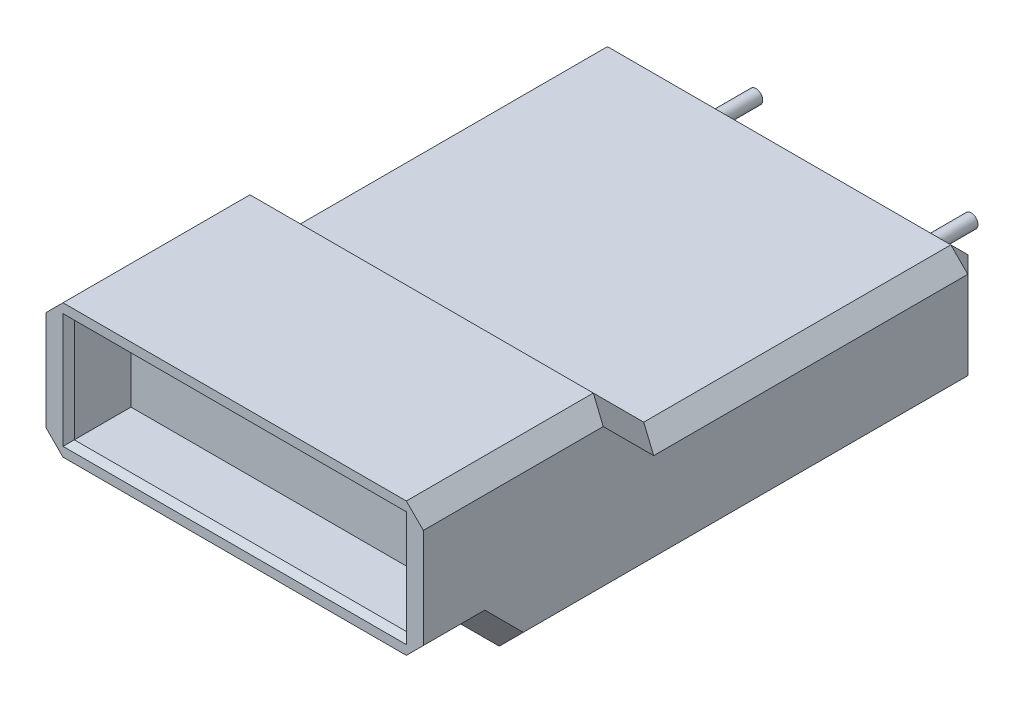
ISO-10303-21;
HEADER;
FILE_DESCRIPTION(('STEP AP214'),'2;1');
FILE_NAME('part.step','',(''),(''),'','','');
FILE_SCHEMA(('AUTOMOTIVE_DESIGN { 1 0 10303 214 1 1 1 1 }'));
ENDSEC;
DATA;
#1=APPLICATION_CONTEXT('core data for automotive mechanical design processes');
#2=APPLICATION_PROTOCOL_DEFINITION('international standard','automotive_design',2000,#1);
#3=PRODUCT_CONTEXT('',#1,'mechanical');
#4=PRODUCT('Part','Part','',(#3));
#5=PRODUCT_RELATED_PRODUCT_CATEGORY('part','',(#4));
#6=PRODUCT_DEFINITION_FORMATION('','',#4);
#7=PRODUCT_DEFINITION_CONTEXT('part definition',#1,'design');
#8=PRODUCT_DEFINITION('design','',#6,#7);
#9=PRODUCT_DEFINITION_SHAPE('','',#8);
#10=(LENGTH_UNIT() NAMED_UNIT(*) SI_UNIT(.MILLI.,.METRE.));
#11=(NAMED_UNIT(*) PLANE_ANGLE_UNIT() SI_UNIT($,.RADIAN.));
#12=(NAMED_UNIT(*) SI_UNIT($,.STERADIAN.) SOLID_ANGLE_UNIT());
#13=UNCERTAINTY_MEASURE_WITH_UNIT(LENGTH_MEASURE(1.E-05),#10,'distance_accuracy_value','');
#14=(GEOMETRIC_REPRESENTATION_CONTEXT(3) GLOBAL_UNCERTAINTY_ASSIGNED_CONTEXT((#13)) GLOBAL_UNIT_ASSIGNED_CONTEXT((#10,
#11,#12)) REPRESENTATION_CONTEXT('',''));
#15=CARTESIAN_POINT('',(0.,0.,0.));
#16=DIRECTION('',(0.,0.,1.));
#17=DIRECTION('',(1.,0.,0.));
#18=AXIS2_PLACEMENT_3D('',#15,#16,#17);
#19=CARTESIAN_POINT('',(-16.65,3.4,24.775));
#20=DIRECTION('',(0.,0.,1.));
#21=DIRECTION('',(1.,0.,0.));
#22=AXIS2_PLACEMENT_3D('',#19,#20,#21);
#23=PLANE('',#22);
#24=DIRECTION('',(1.,0.,0.));
#25=VECTOR('',#24,1.);
#26=CARTESIAN_POINT('',(14.65,14.375,24.775));
#27=LINE('',#26,#25);
#28=CARTESIAN_POINT('',(-15.15,14.375,24.775));
#29=VERTEX_POINT('',#28);
#30=CARTESIAN_POINT('',(15.15,14.375,24.775));
#31=VERTEX_POINT('',#30);
#32=EDGE_CURVE('E410',#29,#31,#27,.T.);
#33=ORIENTED_EDGE('',*,*,#32,.T.);
#34=DIRECTION('',(0.,-1.,0.));
#35=VECTOR('',#34,1.);
#36=CARTESIAN_POINT('',(15.15,4.725,24.775));
#37=LINE('',#36,#35);
#38=CARTESIAN_POINT('',(15.15,4.22499999999999,24.775));
#39=VERTEX_POINT('',#38);
#40=EDGE_CURVE('E414',#31,#39,#37,.T.);
#41=ORIENTED_EDGE('',*,*,#40,.T.);
#42=DIRECTION('',(-1.,0.,0.));
#43=VECTOR('',#42,1.);
#44=CARTESIAN_POINT('',(-14.65,4.22499999999999,24.775));
#45=LINE('',#44,#43);
#46=CARTESIAN_POINT('',(-15.15,4.22499999999999,24.775));
#47=VERTEX_POINT('',#46);
#48=EDGE_CURVE('E412',#39,#47,#45,.T.);
#49=ORIENTED_EDGE('',*,*,#48,.T.);
#50=DIRECTION('',(0.,1.,0.));
#51=VECTOR('',#50,1.);
#52=CARTESIAN_POINT('',(-15.15,13.875,24.775));
#53=LINE('',#52,#51);
#54=EDGE_CURVE('E408',#47,#29,#53,.T.);
#55=ORIENTED_EDGE('',*,*,#54,.T.);
#56=EDGE_LOOP('',(#33,#41,#49,#55));
#57=FACE_BOUND('',#56,.T.);
#58=DIRECTION('',(0.,-1.,0.));
#59=VECTOR('',#58,1.);
#60=CARTESIAN_POINT('',(-16.65,3.4,24.775));
#61=LINE('',#60,#59);
#62=CARTESIAN_POINT('',(-16.65,13.7,24.775));
#63=VERTEX_POINT('',#62);
#64=CARTESIAN_POINT('',(-16.65,4.90000000000001,24.775));
#65=VERTEX_POINT('',#64);
#66=EDGE_CURVE('E253',#63,#65,#61,.T.);
#67=ORIENTED_EDGE('',*,*,#66,.T.);
#68=DIRECTION('',(-0.707106781186546,0.707106781186549,0.));
#69=VECTOR('',#68,1.);
#70=CARTESIAN_POINT('',(-15.9,4.15,24.775));
#71=LINE('',#70,#69);
#72=CARTESIAN_POINT('',(-15.15,3.4,24.775));
#73=VERTEX_POINT('',#72);
#74=EDGE_CURVE('E309',#65,#73,#71,.F.);
#75=ORIENTED_EDGE('',*,*,#74,.T.);
#76=DIRECTION('',(1.,0.,0.));
#77=VECTOR('',#76,1.);
#78=CARTESIAN_POINT('',(-16.65,3.4,24.775));
#79=LINE('',#78,#77);
#80=CARTESIAN_POINT('',(15.15,3.4,24.775));
#81=VERTEX_POINT('',#80);
#82=EDGE_CURVE('E257',#73,#81,#79,.T.);
#83=ORIENTED_EDGE('',*,*,#82,.T.);
#84=DIRECTION('',(0.707106781186549,0.707106781186546,0.));
#85=VECTOR('',#84,1.);
#86=CARTESIAN_POINT('',(-0.750000000000077,-12.5,24.775));
#87=LINE('',#86,#85);
#88=CARTESIAN_POINT('',(16.65,4.9,24.775));
#89=VERTEX_POINT('',#88);
#90=EDGE_CURVE('E307',#81,#89,#87,.T.);
#91=ORIENTED_EDGE('',*,*,#90,.T.);
#92=DIRECTION('',(0.,-1.,0.));
#93=VECTOR('',#92,1.);
#94=CARTESIAN_POINT('',(16.65,3.4,24.775));
#95=LINE('',#94,#93);
#96=CARTESIAN_POINT('',(16.65,13.7,24.775));
#97=VERTEX_POINT('',#96);
#98=EDGE_CURVE('E250',#97,#89,#95,.T.);
#99=ORIENTED_EDGE('',*,*,#98,.F.);
#100=DIRECTION('',(-0.707106781186549,0.707106781186546,0.));
#101=VECTOR('',#100,1.);
#102=CARTESIAN_POINT('',(5.14999999999992,25.2,24.775));
#103=LINE('',#102,#101);
#104=CARTESIAN_POINT('',(15.15,15.2,24.775));
#105=VERTEX_POINT('',#104);
#106=EDGE_CURVE('E303',#97,#105,#103,.T.);
#107=ORIENTED_EDGE('',*,*,#106,.T.);
#108=DIRECTION('',(1.,0.,0.));
#109=VECTOR('',#108,1.);
#110=CARTESIAN_POINT('',(-16.65,15.2,24.775));
#111=LINE('',#110,#109);
#112=CARTESIAN_POINT('',(-15.15,15.2,24.775));
#113=VERTEX_POINT('',#112);
#114=EDGE_CURVE('E258',#113,#105,#111,.T.);
#115=ORIENTED_EDGE('',*,*,#114,.F.);
#116=DIRECTION('',(0.707106781186549,0.707106781186546,0.));
#117=VECTOR('',#116,1.);
#118=CARTESIAN_POINT('',(-21.8,8.55000000000002,24.775));
#119=LINE('',#118,#117);
#120=EDGE_CURVE('E305',#113,#63,#119,.F.);
#121=ORIENTED_EDGE('',*,*,#120,.T.);
#122=EDGE_LOOP('',(#67,#75,#83,#91,#99,#107,#115,#121));
#123=FACE_BOUND('',#122,.T.);
#124=ADVANCED_FACE('F33',(#57,#123),#23,.T.);
#125=CARTESIAN_POINT('',(-16.65,15.2,24.775));
#126=DIRECTION('',(0.,1.,0.));
#127=DIRECTION('',(0.,0.,1.));
#128=AXIS2_PLACEMENT_3D('',#125,#126,#127);
#129=PLANE('',#128);
#130=DIRECTION('',(1.,0.,0.));
#131=VECTOR('',#130,1.);
#132=CARTESIAN_POINT('',(-16.65,15.2,8.275));
#133=LINE('',#132,#131);
#134=CARTESIAN_POINT('',(-15.15,15.2,8.275));
#135=VERTEX_POINT('',#134);
#136=CARTESIAN_POINT('',(15.15,15.2,8.275));
#137=VERTEX_POINT('',#136);
#138=EDGE_CURVE('E262',#135,#137,#133,.T.);
#139=ORIENTED_EDGE('',*,*,#138,.F.);
#140=DIRECTION('',(0.,0.,1.));
#141=VECTOR('',#140,1.);
#142=CARTESIAN_POINT('',(-15.15,15.2,24.775));
#143=LINE('',#142,#141);
#144=EDGE_CURVE('E337',#135,#113,#143,.T.);
#145=ORIENTED_EDGE('',*,*,#144,.T.);
#146=ORIENTED_EDGE('',*,*,#114,.T.);
#147=DIRECTION('',(0.,0.,-1.));
#148=VECTOR('',#147,1.);
#149=CARTESIAN_POINT('',(15.15,15.2,8.275));
#150=LINE('',#149,#148);
#151=EDGE_CURVE('E335',#105,#137,#150,.T.);
#152=ORIENTED_EDGE('',*,*,#151,.T.);
#153=EDGE_LOOP('',(#139,#145,#146,#152));
#154=FACE_BOUND('',#153,.T.);
#155=ADVANCED_FACE('F451',(#154),#129,.T.);
#156=CARTESIAN_POINT('',(-16.65,15.2,8.275));
#157=DIRECTION('',(0.,0.707106781186548,-0.707106781186547));
#158=DIRECTION('',(0.,0.707106781186547,0.707106781186548));
#159=AXIS2_PLACEMENT_3D('',#156,#157,#158);
#160=PLANE('',#159);
#161=DIRECTION('',(1.,0.,0.));
#162=VECTOR('',#161,1.);
#163=CARTESIAN_POINT('',(-16.65,10.75,3.825));
#164=LINE('',#163,#162);
#165=CARTESIAN_POINT('',(-15.15,10.75,3.825));
#166=VERTEX_POINT('',#165);
#167=CARTESIAN_POINT('',(15.15,10.75,3.825));
#168=VERTEX_POINT('',#167);
#169=EDGE_CURVE('E265',#166,#168,#164,.T.);
#170=ORIENTED_EDGE('',*,*,#169,.F.);
#171=DIRECTION('',(0.,0.707106781186547,0.707106781186548));
#172=VECTOR('',#171,1.);
#173=CARTESIAN_POINT('',(-15.15,15.2,8.275));
#174=LINE('',#173,#172);
#175=EDGE_CURVE('E341',#166,#135,#174,.T.);
#176=ORIENTED_EDGE('',*,*,#175,.T.);
#177=ORIENTED_EDGE('',*,*,#138,.T.);
#178=DIRECTION('',(0.,-0.707106781186547,-0.707106781186548));
#179=VECTOR('',#178,1.);
#180=CARTESIAN_POINT('',(15.15,10.75,3.825));
#181=LINE('',#180,#179);
#182=EDGE_CURVE('E339',#137,#168,#181,.T.);
#183=ORIENTED_EDGE('',*,*,#182,.T.);
#184=EDGE_LOOP('',(#170,#176,#177,#183));
#185=FACE_BOUND('',#184,.T.);
#186=ADVANCED_FACE('F457',(#185),#160,.T.);
#187=CARTESIAN_POINT('',(-16.65,10.75,3.825));
#188=DIRECTION('',(0.,1.,0.));
#189=DIRECTION('',(0.,0.,1.));
#190=AXIS2_PLACEMENT_3D('',#187,#188,#189);
#191=PLANE('',#190);
#192=DIRECTION('',(-1.,0.,0.));
#193=VECTOR('',#192,1.);
#194=CARTESIAN_POINT('',(-16.65,10.75,-23.275));
#195=LINE('',#194,#193);
#196=CARTESIAN_POINT('',(15.15,10.75,-23.275));
#197=VERTEX_POINT('',#196);
#198=CARTESIAN_POINT('',(-15.15,10.75,-23.275));
#199=VERTEX_POINT('',#198);
#200=EDGE_CURVE('E345',#197,#199,#195,.T.);
#201=ORIENTED_EDGE('',*,*,#200,.T.);
#202=DIRECTION('',(0.,0.,1.));
#203=VECTOR('',#202,1.);
#204=CARTESIAN_POINT('',(-15.15,10.75,3.825));
#205=LINE('',#204,#203);
#206=EDGE_CURVE('E347',#199,#166,#205,.T.);
#207=ORIENTED_EDGE('',*,*,#206,.T.);
#208=ORIENTED_EDGE('',*,*,#169,.T.);
#209=DIRECTION('',(0.,0.,-1.));
#210=VECTOR('',#209,1.);
#211=CARTESIAN_POINT('',(15.15,10.75,-24.775));
#212=LINE('',#211,#210);
#213=EDGE_CURVE('E343',#168,#197,#212,.T.);
#214=ORIENTED_EDGE('',*,*,#213,.T.);
#215=EDGE_LOOP('',(#201,#207,#208,#214));
#216=FACE_BOUND('',#215,.T.);
#217=ADVANCED_FACE('F605',(#216),#191,.T.);
#218=CARTESIAN_POINT('',(-16.65,10.75,-24.775));
#219=DIRECTION('',(0.,0.,-1.));
#220=DIRECTION('',(-1.,0.,0.));
#221=AXIS2_PLACEMENT_3D('',#218,#219,#220);
#222=PLANE('',#221);
#223=CARTESIAN_POINT('',(-9.55,6.,-24.775));
#224=DIRECTION('',(0.,0.,-1.));
#225=DIRECTION('',(-1.,0.,0.));
#226=AXIS2_PLACEMENT_3D('',#223,#224,#225);
#227=CIRCLE('',#226,1.75);
#228=CARTESIAN_POINT('',(-11.3,6.,-24.775));
#229=VERTEX_POINT('',#228);
#230=EDGE_CURVE('E235',#229,#229,#227,.T.);
#231=ORIENTED_EDGE('',*,*,#230,.F.);
#232=EDGE_LOOP('',(#231));
#233=FACE_BOUND('',#232,.T.);
#234=CARTESIAN_POINT('',(9.45,6.,-24.775));
#235=DIRECTION('',(0.,0.,-1.));
#236=DIRECTION('',(-1.,0.,0.));
#237=AXIS2_PLACEMENT_3D('',#234,#235,#236);
#238=CIRCLE('',#237,1.75);
#239=CARTESIAN_POINT('',(7.7,6.,-24.775));
#240=VERTEX_POINT('',#239);
#241=EDGE_CURVE('E241',#240,#240,#238,.T.);
#242=ORIENTED_EDGE('',*,*,#241,.F.);
#243=EDGE_LOOP('',(#242));
#244=FACE_BOUND('',#243,.T.);
#245=DIRECTION('',(-1.,0.,0.));
#246=VECTOR('',#245,1.);
#247=CARTESIAN_POINT('',(-16.65,1.50000000000001,-24.775));
#248=LINE('',#247,#246);
#249=CARTESIAN_POINT('',(15.15,1.50000000000001,-24.775));
#250=VERTEX_POINT('',#249);
#251=CARTESIAN_POINT('',(-15.15,1.50000000000001,-24.775));
#252=VERTEX_POINT('',#251);
#253=EDGE_CURVE('E279',#250,#252,#248,.T.);
#254=ORIENTED_EDGE('',*,*,#253,.T.);
#255=DIRECTION('',(0.,1.,0.));
#256=VECTOR('',#255,1.);
#257=CARTESIAN_POINT('',(-15.15,10.75,-24.775));
#258=LINE('',#257,#256);
#259=CARTESIAN_POINT('',(-15.15,9.25,-24.775));
#260=VERTEX_POINT('',#259);
#261=EDGE_CURVE('E281',#252,#260,#258,.T.);
#262=ORIENTED_EDGE('',*,*,#261,.T.);
#263=DIRECTION('',(1.,0.,0.));
#264=VECTOR('',#263,1.);
#265=CARTESIAN_POINT('',(-16.65,9.25,-24.775));
#266=LINE('',#265,#264);
#267=CARTESIAN_POINT('',(15.15,9.25,-24.775));
#268=VERTEX_POINT('',#267);
#269=EDGE_CURVE('E261',#260,#268,#266,.T.);
#270=ORIENTED_EDGE('',*,*,#269,.T.);
#271=DIRECTION('',(0.,-1.,0.));
#272=VECTOR('',#271,1.);
#273=CARTESIAN_POINT('',(15.15,0.,-24.775));
#274=LINE('',#273,#272);
#275=EDGE_CURVE('E277',#268,#250,#274,.T.);
#276=ORIENTED_EDGE('',*,*,#275,.T.);
#277=EDGE_LOOP('',(#254,#262,#270,#276));
#278=FACE_BOUND('',#277,.T.);
#279=ADVANCED_FACE('F609',(#233,#244,#278),#222,.T.);
#280=CARTESIAN_POINT('',(-16.65,0.,-24.775));
#281=DIRECTION('',(0.,-1.,0.));
#282=DIRECTION('',(0.,0.,-1.));
#283=AXIS2_PLACEMENT_3D('',#280,#281,#282);
#284=PLANE('',#283);
#285=DIRECTION('',(1.,0.,0.));
#286=VECTOR('',#285,1.);
#287=CARTESIAN_POINT('',(-16.65,0.,16.575));
#288=LINE('',#287,#286);
#289=CARTESIAN_POINT('',(-15.15,0.,16.575));
#290=VERTEX_POINT('',#289);
#291=CARTESIAN_POINT('',(15.15,0.,16.575));
#292=VERTEX_POINT('',#291);
#293=EDGE_CURVE('E268',#290,#292,#288,.T.);
#294=ORIENTED_EDGE('',*,*,#293,.F.);
#295=DIRECTION('',(0.,0.,-1.));
#296=VECTOR('',#295,1.);
#297=CARTESIAN_POINT('',(-15.15,0.,-24.775));
#298=LINE('',#297,#296);
#299=CARTESIAN_POINT('',(-15.15,0.,-23.275));
#300=VERTEX_POINT('',#299);
#301=EDGE_CURVE('E319',#290,#300,#298,.T.);
#302=ORIENTED_EDGE('',*,*,#301,.T.);
#303=DIRECTION('',(1.,0.,0.));
#304=VECTOR('',#303,1.);
#305=CARTESIAN_POINT('',(-16.65,0.,-23.275));
#306=LINE('',#305,#304);
#307=CARTESIAN_POINT('',(15.15,0.,-23.275));
#308=VERTEX_POINT('',#307);
#309=EDGE_CURVE('E317',#300,#308,#306,.T.);
#310=ORIENTED_EDGE('',*,*,#309,.T.);
#311=DIRECTION('',(0.,0.,1.));
#312=VECTOR('',#311,1.);
#313=CARTESIAN_POINT('',(15.15,0.,16.575));
#314=LINE('',#313,#312);
#315=EDGE_CURVE('E315',#308,#292,#314,.T.);
#316=ORIENTED_EDGE('',*,*,#315,.T.);
#317=EDGE_LOOP('',(#294,#302,#310,#316));
#318=FACE_BOUND('',#317,.T.);
#319=ADVANCED_FACE('F613',(#318),#284,.T.);
#320=CARTESIAN_POINT('',(-16.65,0.,16.575));
#321=DIRECTION('',(0.,-0.707106781186548,0.707106781186547));
#322=DIRECTION('',(0.,-0.707106781186547,-0.707106781186548));
#323=AXIS2_PLACEMENT_3D('',#320,#321,#322);
#324=PLANE('',#323);
#325=DIRECTION('',(1.,0.,0.));
#326=VECTOR('',#325,1.);
#327=CARTESIAN_POINT('',(-16.65,3.4,19.975));
#328=LINE('',#327,#326);
#329=CARTESIAN_POINT('',(-15.15,3.4,19.975));
#330=VERTEX_POINT('',#329);
#331=CARTESIAN_POINT('',(15.15,3.4,19.975));
#332=VERTEX_POINT('',#331);
#333=EDGE_CURVE('E271',#330,#332,#328,.T.);
#334=ORIENTED_EDGE('',*,*,#333,.F.);
#335=DIRECTION('',(0.,-0.707106781186547,-0.707106781186548));
#336=VECTOR('',#335,1.);
#337=CARTESIAN_POINT('',(-15.15,0.,16.575));
#338=LINE('',#337,#336);
#339=EDGE_CURVE('E313',#330,#290,#338,.T.);
#340=ORIENTED_EDGE('',*,*,#339,.T.);
#341=ORIENTED_EDGE('',*,*,#293,.T.);
#342=DIRECTION('',(0.,0.707106781186547,0.707106781186548));
#343=VECTOR('',#342,1.);
#344=CARTESIAN_POINT('',(15.15,3.4,19.975));
#345=LINE('',#344,#343);
#346=EDGE_CURVE('E311',#292,#332,#345,.T.);
#347=ORIENTED_EDGE('',*,*,#346,.T.);
#348=EDGE_LOOP('',(#334,#340,#341,#347));
#349=FACE_BOUND('',#348,.T.);
#350=ADVANCED_FACE('F616',(#349),#324,.T.);
#351=CARTESIAN_POINT('',(-16.65,3.4,19.975));
#352=DIRECTION('',(0.,-1.,0.));
#353=DIRECTION('',(0.,0.,-1.));
#354=AXIS2_PLACEMENT_3D('',#351,#352,#353);
#355=PLANE('',#354);
#356=ORIENTED_EDGE('',*,*,#82,.F.);
#357=DIRECTION('',(0.,0.,-1.));
#358=VECTOR('',#357,1.);
#359=CARTESIAN_POINT('',(-15.15,3.4,19.975));
#360=LINE('',#359,#358);
#361=EDGE_CURVE('E301',#73,#330,#360,.T.);
#362=ORIENTED_EDGE('',*,*,#361,.T.);
#363=ORIENTED_EDGE('',*,*,#333,.T.);
#364=DIRECTION('',(0.,0.,1.));
#365=VECTOR('',#364,1.);
#366=CARTESIAN_POINT('',(15.15,3.4,24.775));
#367=LINE('',#366,#365);
#368=EDGE_CURVE('E299',#332,#81,#367,.T.);
#369=ORIENTED_EDGE('',*,*,#368,.T.);
#370=EDGE_LOOP('',(#356,#362,#363,#369));
#371=FACE_BOUND('',#370,.T.);
#372=ADVANCED_FACE('F463',(#371),#355,.T.);
#373=CARTESIAN_POINT('',(-16.65,0.,0.));
#374=DIRECTION('',(-1.,0.,0.));
#375=DIRECTION('',(0.,0.,1.));
#376=AXIS2_PLACEMENT_3D('',#373,#374,#375);
#377=PLANE('',#376);
#378=DIRECTION('',(0.,0.707106781186547,0.707106781186548));
#379=VECTOR('',#378,1.);
#380=CARTESIAN_POINT('',(-16.65,-7.22683982822017,7.22683982822017));
#381=LINE('',#380,#379);
#382=CARTESIAN_POINT('',(-16.65,1.50000000000001,15.9536796564404));
#383=VERTEX_POINT('',#382);
#384=CARTESIAN_POINT('',(-16.65,4.90000000000001,19.3536796564404));
#385=VERTEX_POINT('',#384);
#386=EDGE_CURVE('E295',#383,#385,#381,.T.);
#387=ORIENTED_EDGE('',*,*,#386,.T.);
#388=DIRECTION('',(0.,0.,1.));
#389=VECTOR('',#388,1.);
#390=CARTESIAN_POINT('',(-16.65,4.90000000000001,0.));
#391=LINE('',#390,#389);
#392=EDGE_CURVE('E297',#385,#65,#391,.T.);
#393=ORIENTED_EDGE('',*,*,#392,.T.);
#394=ORIENTED_EDGE('',*,*,#66,.F.);
#395=DIRECTION('',(0.,0.,-1.));
#396=VECTOR('',#395,1.);
#397=CARTESIAN_POINT('',(-16.65,13.7,0.));
#398=LINE('',#397,#396);
#399=CARTESIAN_POINT('',(-16.65,13.7,8.89632034355965));
#400=VERTEX_POINT('',#399);
#401=EDGE_CURVE('E288',#63,#400,#398,.T.);
#402=ORIENTED_EDGE('',*,*,#401,.T.);
#403=DIRECTION('',(0.,-0.707106781186547,-0.707106781186548));
#404=VECTOR('',#403,1.);
#405=CARTESIAN_POINT('',(-16.65,2.40183982822018,-2.40183982822018));
#406=LINE('',#405,#404);
#407=CARTESIAN_POINT('',(-16.65,9.24999999999999,4.44632034355964));
#408=VERTEX_POINT('',#407);
#409=EDGE_CURVE('E286',#400,#408,#406,.T.);
#410=ORIENTED_EDGE('',*,*,#409,.T.);
#411=DIRECTION('',(0.,0.,-1.));
#412=VECTOR('',#411,1.);
#413=CARTESIAN_POINT('',(-16.65,9.24999999999999,0.));
#414=LINE('',#413,#412);
#415=CARTESIAN_POINT('',(-16.65,9.24999999999999,-23.275));
#416=VERTEX_POINT('',#415);
#417=EDGE_CURVE('E284',#408,#416,#414,.T.);
#418=ORIENTED_EDGE('',*,*,#417,.T.);
#419=DIRECTION('',(0.,-1.,0.));
#420=VECTOR('',#419,1.);
#421=CARTESIAN_POINT('',(-16.65,0.,-23.275));
#422=LINE('',#421,#420);
#423=CARTESIAN_POINT('',(-16.65,1.50000000000001,-23.275));
#424=VERTEX_POINT('',#423);
#425=EDGE_CURVE('E290',#416,#424,#422,.T.);
#426=ORIENTED_EDGE('',*,*,#425,.T.);
#427=DIRECTION('',(0.,0.,1.));
#428=VECTOR('',#427,1.);
#429=CARTESIAN_POINT('',(-16.65,1.50000000000001,0.));
#430=LINE('',#429,#428);
#431=EDGE_CURVE('E293',#424,#383,#430,.T.);
#432=ORIENTED_EDGE('',*,*,#431,.T.);
#433=EDGE_LOOP('',(#387,#393,#394,#402,#410,#418,#426,#432));
#434=FACE_BOUND('',#433,.T.);
#435=ADVANCED_FACE('F598',(#434),#377,.T.);
#436=CARTESIAN_POINT('',(16.65,0.,0.));
#437=DIRECTION('',(-1.,0.,0.));
#438=DIRECTION('',(0.,0.,1.));
#439=AXIS2_PLACEMENT_3D('',#436,#437,#438);
#440=PLANE('',#439);
#441=ORIENTED_EDGE('',*,*,#98,.T.);
#442=DIRECTION('',(0.,0.,-1.));
#443=VECTOR('',#442,1.);
#444=CARTESIAN_POINT('',(16.65,4.9,19.975));
#445=LINE('',#444,#443);
#446=CARTESIAN_POINT('',(16.65,4.9,19.3536796564404));
#447=VERTEX_POINT('',#446);
#448=EDGE_CURVE('E333',#89,#447,#445,.T.);
#449=ORIENTED_EDGE('',*,*,#448,.T.);
#450=DIRECTION('',(0.,-0.707106781186547,-0.707106781186548));
#451=VECTOR('',#450,1.);
#452=CARTESIAN_POINT('',(16.65,1.06066017177982,15.5143398282202));
#453=LINE('',#452,#451);
#454=CARTESIAN_POINT('',(16.65,1.5,15.9536796564404));
#455=VERTEX_POINT('',#454);
#456=EDGE_CURVE('E331',#447,#455,#453,.T.);
#457=ORIENTED_EDGE('',*,*,#456,.T.);
#458=DIRECTION('',(0.,0.,-1.));
#459=VECTOR('',#458,1.);
#460=CARTESIAN_POINT('',(16.65,1.5,-24.775));
#461=LINE('',#460,#459);
#462=CARTESIAN_POINT('',(16.65,1.5,-23.275));
#463=VERTEX_POINT('',#462);
#464=EDGE_CURVE('E329',#455,#463,#461,.T.);
#465=ORIENTED_EDGE('',*,*,#464,.T.);
#466=DIRECTION('',(0.,1.,0.));
#467=VECTOR('',#466,1.);
#468=CARTESIAN_POINT('',(16.65,10.75,-23.275));
#469=LINE('',#468,#467);
#470=CARTESIAN_POINT('',(16.65,9.25,-23.275));
#471=VERTEX_POINT('',#470);
#472=EDGE_CURVE('E327',#463,#471,#469,.T.);
#473=ORIENTED_EDGE('',*,*,#472,.T.);
#474=DIRECTION('',(0.,0.,1.));
#475=VECTOR('',#474,1.);
#476=CARTESIAN_POINT('',(16.65,9.25,3.825));
#477=LINE('',#476,#475);
#478=CARTESIAN_POINT('',(16.65,9.25,4.44632034355964));
#479=VERTEX_POINT('',#478);
#480=EDGE_CURVE('E325',#471,#479,#477,.T.);
#481=ORIENTED_EDGE('',*,*,#480,.T.);
#482=DIRECTION('',(0.,0.707106781186547,0.707106781186548));
#483=VECTOR('',#482,1.);
#484=CARTESIAN_POINT('',(16.65,14.1393398282202,9.33566017177982));
#485=LINE('',#484,#483);
#486=CARTESIAN_POINT('',(16.65,13.7,8.89632034355964));
#487=VERTEX_POINT('',#486);
#488=EDGE_CURVE('E323',#479,#487,#485,.T.);
#489=ORIENTED_EDGE('',*,*,#488,.T.);
#490=DIRECTION('',(0.,0.,1.));
#491=VECTOR('',#490,1.);
#492=CARTESIAN_POINT('',(16.65,13.7,24.775));
#493=LINE('',#492,#491);
#494=EDGE_CURVE('E321',#487,#97,#493,.T.);
#495=ORIENTED_EDGE('',*,*,#494,.T.);
#496=EDGE_LOOP('',(#441,#449,#457,#465,#473,#481,#489,#495));
#497=FACE_BOUND('',#496,.T.);
#498=ADVANCED_FACE('F545',(#497),#440,.F.);
#499=CARTESIAN_POINT('',(16.65,4.9,0.));
#500=DIRECTION('',(0.707106781186546,-0.707106781186549,0.));
#501=DIRECTION('',(0.,0.,1.));
#502=AXIS2_PLACEMENT_3D('',#499,#500,#501);
#503=PLANE('',#502);
#504=ORIENTED_EDGE('',*,*,#90,.F.);
#505=ORIENTED_EDGE('',*,*,#368,.F.);
#506=DIRECTION('',(-0.678598344545849,-0.678598344545846,0.281084637714819));
#507=VECTOR('',#506,1.);
#508=CARTESIAN_POINT('',(20.3415899470262,8.59158994702623,17.8245730336619));
#509=LINE('',#508,#507);
#510=EDGE_CURVE('E254',#447,#332,#509,.T.);
#511=ORIENTED_EDGE('',*,*,#510,.F.);
#512=ORIENTED_EDGE('',*,*,#448,.F.);
#513=EDGE_LOOP('',(#504,#505,#511,#512));
#514=FACE_BOUND('',#513,.T.);
#515=ADVANCED_FACE('F541',(#514),#503,.T.);
#516=CARTESIAN_POINT('',(16.65,13.7,0.));
#517=DIRECTION('',(0.707106781186546,0.707106781186549,0.));
#518=DIRECTION('',(0.,0.,-1.));
#519=AXIS2_PLACEMENT_3D('',#516,#517,#518);
#520=PLANE('',#519);
#521=ORIENTED_EDGE('',*,*,#106,.F.);
#522=ORIENTED_EDGE('',*,*,#494,.F.);
#523=DIRECTION('',(-0.678598344545849,0.678598344545846,-0.281084637714819));
#524=VECTOR('',#523,1.);
#525=CARTESIAN_POINT('',(14.9530840993133,15.3969159006867,8.19343476328867));
#526=LINE('',#525,#524);
#527=EDGE_CURVE('E401',#137,#487,#526,.F.);
#528=ORIENTED_EDGE('',*,*,#527,.F.);
#529=ORIENTED_EDGE('',*,*,#151,.F.);
#530=EDGE_LOOP('',(#521,#522,#528,#529));
#531=FACE_BOUND('',#530,.T.);
#532=ADVANCED_FACE('F537',(#531),#520,.T.);
#533=CARTESIAN_POINT('',(16.65,-7.22683982822018,7.22683982822018));
#534=DIRECTION('',(0.707106781186546,-0.500000000000001,0.500000000000001));
#535=DIRECTION('',(0.,0.707106781186547,0.707106781186548));
#536=AXIS2_PLACEMENT_3D('',#533,#534,#535);
#537=PLANE('',#536);
#538=ORIENTED_EDGE('',*,*,#510,.T.);
#539=ORIENTED_EDGE('',*,*,#346,.F.);
#540=DIRECTION('',(-0.678598344545849,-0.678598344545846,0.281084637714819));
#541=VECTOR('',#540,1.);
#542=CARTESIAN_POINT('',(19.6930618096024,4.54306180960238,14.6932021837634));
#543=LINE('',#542,#541);
#544=EDGE_CURVE('E398',#455,#292,#543,.T.);
#545=ORIENTED_EDGE('',*,*,#544,.F.);
#546=ORIENTED_EDGE('',*,*,#456,.F.);
#547=EDGE_LOOP('',(#538,#539,#545,#546));
#548=FACE_BOUND('',#547,.T.);
#549=ADVANCED_FACE('F533',(#548),#537,.T.);
#550=CARTESIAN_POINT('',(16.65,2.40183982822018,-2.40183982822018));
#551=DIRECTION('',(0.707106781186546,0.500000000000001,-0.500000000000001));
#552=DIRECTION('',(0.,-0.707106781186547,-0.707106781186548));
#553=AXIS2_PLACEMENT_3D('',#550,#551,#552);
#554=PLANE('',#553);
#555=ORIENTED_EDGE('',*,*,#527,.T.);
#556=ORIENTED_EDGE('',*,*,#488,.F.);
#557=DIRECTION('',(-0.678598344545849,0.678598344545846,-0.281084637714819));
#558=VECTOR('',#557,1.);
#559=CARTESIAN_POINT('',(15.8018929850593,10.0981070149407,4.09502291562742));
#560=LINE('',#559,#558);
#561=EDGE_CURVE('E395',#168,#479,#560,.F.);
#562=ORIENTED_EDGE('',*,*,#561,.F.);
#563=ORIENTED_EDGE('',*,*,#182,.F.);
#564=EDGE_LOOP('',(#555,#556,#562,#563));
#565=FACE_BOUND('',#564,.T.);
#566=ADVANCED_FACE('F529',(#565),#554,.T.);
#567=CARTESIAN_POINT('',(-15.15,3.4,19.975));
#568=DIRECTION('',(0.707106781186549,0.707106781186546,0.));
#569=DIRECTION('',(0.,0.,-1.));
#570=AXIS2_PLACEMENT_3D('',#567,#568,#569);
#571=PLANE('',#570);
#572=ORIENTED_EDGE('',*,*,#74,.F.);
#573=ORIENTED_EDGE('',*,*,#392,.F.);
#574=DIRECTION('',(-0.678598344545845,0.678598344545849,-0.281084637714821));
#575=VECTOR('',#574,1.);
#576=CARTESIAN_POINT('',(-15.15,3.4,19.975));
#577=LINE('',#576,#575);
#578=EDGE_CURVE('E392',#330,#385,#577,.T.);
#579=ORIENTED_EDGE('',*,*,#578,.F.);
#580=ORIENTED_EDGE('',*,*,#361,.F.);
#581=EDGE_LOOP('',(#572,#573,#579,#580));
#582=FACE_BOUND('',#581,.T.);
#583=ADVANCED_FACE('F525',(#582),#571,.F.);
#584=CARTESIAN_POINT('',(16.65,1.5,0.));
#585=DIRECTION('',(0.707106781186546,-0.707106781186549,0.));
#586=DIRECTION('',(0.,0.,1.));
#587=AXIS2_PLACEMENT_3D('',#584,#585,#586);
#588=PLANE('',#587);
#589=ORIENTED_EDGE('',*,*,#544,.T.);
#590=ORIENTED_EDGE('',*,*,#315,.F.);
#591=DIRECTION('',(-0.707106781186549,-0.707106781186546,0.));
#592=VECTOR('',#591,1.);
#593=CARTESIAN_POINT('',(15.15,0.,-23.275));
#594=LINE('',#593,#592);
#595=EDGE_CURVE('E389',#463,#308,#594,.T.);
#596=ORIENTED_EDGE('',*,*,#595,.F.);
#597=ORIENTED_EDGE('',*,*,#464,.F.);
#598=EDGE_LOOP('',(#589,#590,#596,#597));
#599=FACE_BOUND('',#598,.T.);
#600=ADVANCED_FACE('F521',(#599),#588,.T.);
#601=CARTESIAN_POINT('',(16.65,0.,-23.275));
#602=DIRECTION('',(0.707106781186546,0.,-0.707106781186549));
#603=DIRECTION('',(0.,-1.,0.));
#604=AXIS2_PLACEMENT_3D('',#601,#602,#603);
#605=PLANE('',#604);
#606=DIRECTION('',(-0.707106781186549,0.,-0.707106781186546));
#607=VECTOR('',#606,1.);
#608=CARTESIAN_POINT('',(16.65,9.25,-23.275));
#609=LINE('',#608,#607);
#610=EDGE_CURVE('E383',#471,#268,#609,.T.);
#611=ORIENTED_EDGE('',*,*,#610,.F.);
#612=ORIENTED_EDGE('',*,*,#472,.F.);
#613=DIRECTION('',(0.707106781186549,0.,0.707106781186546));
#614=VECTOR('',#613,1.);
#615=CARTESIAN_POINT('',(15.9,1.5,-24.025));
#616=LINE('',#615,#614);
#617=EDGE_CURVE('E386',#250,#463,#616,.T.);
#618=ORIENTED_EDGE('',*,*,#617,.F.);
#619=ORIENTED_EDGE('',*,*,#275,.F.);
#620=EDGE_LOOP('',(#611,#612,#618,#619));
#621=FACE_BOUND('',#620,.T.);
#622=ADVANCED_FACE('F517',(#621),#605,.T.);
#623=CARTESIAN_POINT('',(16.65,9.25,0.));
#624=DIRECTION('',(0.707106781186546,0.707106781186549,0.));
#625=DIRECTION('',(0.,0.,-1.));
#626=AXIS2_PLACEMENT_3D('',#623,#624,#625);
#627=PLANE('',#626);
#628=ORIENTED_EDGE('',*,*,#561,.T.);
#629=ORIENTED_EDGE('',*,*,#480,.F.);
#630=DIRECTION('',(0.707106781186549,-0.707106781186546,0.));
#631=VECTOR('',#630,1.);
#632=CARTESIAN_POINT('',(16.65,9.25,-23.275));
#633=LINE('',#632,#631);
#634=EDGE_CURVE('E380',#197,#471,#633,.T.);
#635=ORIENTED_EDGE('',*,*,#634,.F.);
#636=ORIENTED_EDGE('',*,*,#213,.F.);
#637=EDGE_LOOP('',(#628,#629,#635,#636));
#638=FACE_BOUND('',#637,.T.);
#639=ADVANCED_FACE('F513',(#638),#627,.T.);
#640=CARTESIAN_POINT('',(-15.15,15.2,24.775));
#641=DIRECTION('',(0.707106781186546,-0.707106781186549,0.));
#642=DIRECTION('',(0.,0.,1.));
#643=AXIS2_PLACEMENT_3D('',#640,#641,#642);
#644=PLANE('',#643);
#645=ORIENTED_EDGE('',*,*,#120,.F.);
#646=ORIENTED_EDGE('',*,*,#144,.F.);
#647=DIRECTION('',(0.678598344545847,0.678598344545844,-0.281084637714827));
#648=VECTOR('',#647,1.);
#649=CARTESIAN_POINT('',(-15.15,15.2,8.27499999999999));
#650=LINE('',#649,#648);
#651=EDGE_CURVE('E377',#400,#135,#650,.T.);
#652=ORIENTED_EDGE('',*,*,#651,.F.);
#653=ORIENTED_EDGE('',*,*,#401,.F.);
#654=EDGE_LOOP('',(#645,#646,#652,#653));
#655=FACE_BOUND('',#654,.T.);
#656=ADVANCED_FACE('F509',(#655),#644,.F.);
#657=CARTESIAN_POINT('',(-15.15,0.,16.575));
#658=DIRECTION('',(0.707106781186549,0.499999999999999,-0.499999999999999));
#659=DIRECTION('',(0.,-0.707106781186547,-0.707106781186548));
#660=AXIS2_PLACEMENT_3D('',#657,#658,#659);
#661=PLANE('',#660);
#662=ORIENTED_EDGE('',*,*,#578,.T.);
#663=ORIENTED_EDGE('',*,*,#386,.F.);
#664=DIRECTION('',(-0.678598344545845,0.678598344545849,-0.281084637714821));
#665=VECTOR('',#664,1.);
#666=CARTESIAN_POINT('',(-23.0372466124931,7.88724661249311,13.3079954833241));
#667=LINE('',#666,#665);
#668=EDGE_CURVE('E374',#290,#383,#667,.T.);
#669=ORIENTED_EDGE('',*,*,#668,.F.);
#670=ORIENTED_EDGE('',*,*,#339,.F.);
#671=EDGE_LOOP('',(#662,#663,#669,#670));
#672=FACE_BOUND('',#671,.T.);
#673=ADVANCED_FACE('F505',(#672),#661,.F.);
#674=CARTESIAN_POINT('',(15.15,0.,-23.275));
#675=DIRECTION('',(0.577350269189623,-0.577350269189626,-0.577350269189628));
#676=DIRECTION('',(0.,0.707106781186549,-0.707106781186546));
#677=AXIS2_PLACEMENT_3D('',#674,#675,#676);
#678=PLANE('',#677);
#679=ORIENTED_EDGE('',*,*,#617,.T.);
#680=ORIENTED_EDGE('',*,*,#595,.T.);
#681=DIRECTION('',(0.,-0.707106781186549,0.707106781186546));
#682=VECTOR('',#681,1.);
#683=CARTESIAN_POINT('',(15.15,0.,-23.275));
#684=LINE('',#683,#682);
#685=EDGE_CURVE('E371',#250,#308,#684,.T.);
#686=ORIENTED_EDGE('',*,*,#685,.F.);
#687=EDGE_LOOP('',(#679,#680,#686));
#688=FACE_BOUND('',#687,.T.);
#689=ADVANCED_FACE('F501',(#688),#678,.T.);
#690=CARTESIAN_POINT('',(16.65,9.25,-23.275));
#691=DIRECTION('',(0.577350269189623,0.577350269189629,-0.577350269189626));
#692=DIRECTION('',(0.,0.707106781186546,0.707106781186549));
#693=AXIS2_PLACEMENT_3D('',#690,#691,#692);
#694=PLANE('',#693);
#695=ORIENTED_EDGE('',*,*,#634,.T.);
#696=ORIENTED_EDGE('',*,*,#610,.T.);
#697=DIRECTION('',(0.,-0.707106781186546,-0.707106781186549));
#698=VECTOR('',#697,1.);
#699=CARTESIAN_POINT('',(15.15,10.,-24.025));
#700=LINE('',#699,#698);
#701=EDGE_CURVE('E368',#197,#268,#700,.T.);
#702=ORIENTED_EDGE('',*,*,#701,.F.);
#703=EDGE_LOOP('',(#695,#696,#702));
#704=FACE_BOUND('',#703,.T.);
#705=ADVANCED_FACE('F497',(#704),#694,.T.);
#706=CARTESIAN_POINT('',(-15.15,15.2,8.275));
#707=DIRECTION('',(0.707106781186549,-0.499999999999999,0.499999999999999));
#708=DIRECTION('',(0.,0.707106781186547,0.707106781186548));
#709=AXIS2_PLACEMENT_3D('',#706,#707,#708);
#710=PLANE('',#709);
#711=ORIENTED_EDGE('',*,*,#651,.T.);
#712=ORIENTED_EDGE('',*,*,#175,.F.);
#713=DIRECTION('',(0.678598344545846,0.678598344545849,-0.28108463771482));
#714=VECTOR('',#713,1.);
#715=CARTESIAN_POINT('',(-13.9496029619153,11.9503970380847,3.32777926659282));
#716=LINE('',#715,#714);
#717=EDGE_CURVE('E365',#408,#166,#716,.T.);
#718=ORIENTED_EDGE('',*,*,#717,.F.);
#719=ORIENTED_EDGE('',*,*,#409,.F.);
#720=EDGE_LOOP('',(#711,#712,#718,#719));
#721=FACE_BOUND('',#720,.T.);
#722=ADVANCED_FACE('F493',(#721),#710,.F.);
#723=CARTESIAN_POINT('',(-15.15,0.,-24.775));
#724=DIRECTION('',(0.707106781186549,0.707106781186546,0.));
#725=DIRECTION('',(0.,0.,-1.));
#726=AXIS2_PLACEMENT_3D('',#723,#724,#725);
#727=PLANE('',#726);
#728=ORIENTED_EDGE('',*,*,#668,.T.);
#729=ORIENTED_EDGE('',*,*,#431,.F.);
#730=DIRECTION('',(0.707106781186546,-0.707106781186549,0.));
#731=VECTOR('',#730,1.);
#732=CARTESIAN_POINT('',(-16.65,1.50000000000001,-23.275));
#733=LINE('',#732,#731);
#734=EDGE_CURVE('E362',#300,#424,#733,.F.);
#735=ORIENTED_EDGE('',*,*,#734,.F.);
#736=ORIENTED_EDGE('',*,*,#301,.F.);
#737=EDGE_LOOP('',(#728,#729,#735,#736));
#738=FACE_BOUND('',#737,.T.);
#739=ADVANCED_FACE('F489',(#738),#727,.F.);
#740=CARTESIAN_POINT('',(-16.65,0.,-23.275));
#741=DIRECTION('',(0.,0.707106781186546,0.707106781186549));
#742=DIRECTION('',(1.,0.,0.));
#743=AXIS2_PLACEMENT_3D('',#740,#741,#742);
#744=PLANE('',#743);
#745=ORIENTED_EDGE('',*,*,#685,.T.);
#746=ORIENTED_EDGE('',*,*,#309,.F.);
#747=DIRECTION('',(0.,0.707106781186549,-0.707106781186546));
#748=VECTOR('',#747,1.);
#749=CARTESIAN_POINT('',(-15.15,0.750000000000004,-24.025));
#750=LINE('',#749,#748);
#751=EDGE_CURVE('E359',#252,#300,#750,.F.);
#752=ORIENTED_EDGE('',*,*,#751,.F.);
#753=ORIENTED_EDGE('',*,*,#253,.F.);
#754=EDGE_LOOP('',(#745,#746,#752,#753));
#755=FACE_BOUND('',#754,.T.);
#756=ADVANCED_FACE('F485',(#755),#744,.F.);
#757=CARTESIAN_POINT('',(-16.65,9.25,-24.775));
#758=DIRECTION('',(0.,-0.707106781186549,0.707106781186546));
#759=DIRECTION('',(1.,0.,0.));
#760=AXIS2_PLACEMENT_3D('',#757,#758,#759);
#761=PLANE('',#760);
#762=ORIENTED_EDGE('',*,*,#701,.T.);
#763=ORIENTED_EDGE('',*,*,#269,.F.);
#764=DIRECTION('',(0.,0.707106781186546,0.707106781186549));
#765=VECTOR('',#764,1.);
#766=CARTESIAN_POINT('',(-15.15,9.25,-24.775));
#767=LINE('',#766,#765);
#768=EDGE_CURVE('E356',#199,#260,#767,.F.);
#769=ORIENTED_EDGE('',*,*,#768,.F.);
#770=ORIENTED_EDGE('',*,*,#200,.F.);
#771=EDGE_LOOP('',(#762,#763,#769,#770));
#772=FACE_BOUND('',#771,.T.);
#773=ADVANCED_FACE('F481',(#772),#761,.F.);
#774=CARTESIAN_POINT('',(-15.15,10.75,3.825));
#775=DIRECTION('',(0.707106781186549,-0.707106781186546,0.));
#776=DIRECTION('',(0.,0.,1.));
#777=AXIS2_PLACEMENT_3D('',#774,#775,#776);
#778=PLANE('',#777);
#779=ORIENTED_EDGE('',*,*,#717,.T.);
#780=ORIENTED_EDGE('',*,*,#206,.F.);
#781=DIRECTION('',(-0.707106781186546,-0.707106781186549,0.));
#782=VECTOR('',#781,1.);
#783=CARTESIAN_POINT('',(-15.9,9.99999999999999,-23.275));
#784=LINE('',#783,#782);
#785=EDGE_CURVE('E353',#416,#199,#784,.F.);
#786=ORIENTED_EDGE('',*,*,#785,.F.);
#787=ORIENTED_EDGE('',*,*,#417,.F.);
#788=EDGE_LOOP('',(#779,#780,#786,#787));
#789=FACE_BOUND('',#788,.T.);
#790=ADVANCED_FACE('F477',(#789),#778,.F.);
#791=CARTESIAN_POINT('',(-16.65,1.50000000000001,-23.275));
#792=DIRECTION('',(-0.577350269189628,-0.577350269189623,-0.577350269189626));
#793=DIRECTION('',(-0.707106781186546,0.,0.707106781186549));
#794=AXIS2_PLACEMENT_3D('',#791,#792,#793);
#795=PLANE('',#794);
#796=ORIENTED_EDGE('',*,*,#751,.T.);
#797=ORIENTED_EDGE('',*,*,#734,.T.);
#798=DIRECTION('',(-0.707106781186546,0.,0.707106781186549));
#799=VECTOR('',#798,1.);
#800=CARTESIAN_POINT('',(-16.65,1.50000000000001,-23.275));
#801=LINE('',#800,#799);
#802=EDGE_CURVE('E351',#252,#424,#801,.T.);
#803=ORIENTED_EDGE('',*,*,#802,.F.);
#804=EDGE_LOOP('',(#796,#797,#803));
#805=FACE_BOUND('',#804,.T.);
#806=ADVANCED_FACE('F473',(#805),#795,.T.);
#807=CARTESIAN_POINT('',(-15.15,9.25,-24.775));
#808=DIRECTION('',(-0.577350269189629,0.577350269189626,-0.577350269189623));
#809=DIRECTION('',(-0.707106781186546,-0.707106781186549,0.));
#810=AXIS2_PLACEMENT_3D('',#807,#808,#809);
#811=PLANE('',#810);
#812=ORIENTED_EDGE('',*,*,#785,.T.);
#813=ORIENTED_EDGE('',*,*,#768,.T.);
#814=DIRECTION('',(0.707106781186546,0.,-0.707106781186549));
#815=VECTOR('',#814,1.);
#816=CARTESIAN_POINT('',(-15.15,9.25,-24.775));
#817=LINE('',#816,#815);
#818=EDGE_CURVE('E247',#416,#260,#817,.T.);
#819=ORIENTED_EDGE('',*,*,#818,.F.);
#820=EDGE_LOOP('',(#812,#813,#819));
#821=FACE_BOUND('',#820,.T.);
#822=ADVANCED_FACE('F469',(#821),#811,.T.);
#823=CARTESIAN_POINT('',(-15.15,10.75,-24.775));
#824=DIRECTION('',(0.707106781186549,0.,0.707106781186546));
#825=DIRECTION('',(0.,1.,0.));
#826=AXIS2_PLACEMENT_3D('',#823,#824,#825);
#827=PLANE('',#826);
#828=ORIENTED_EDGE('',*,*,#802,.T.);
#829=ORIENTED_EDGE('',*,*,#425,.F.);
#830=ORIENTED_EDGE('',*,*,#818,.T.);
#831=ORIENTED_EDGE('',*,*,#261,.F.);
#832=EDGE_LOOP('',(#828,#829,#830,#831));
#833=FACE_BOUND('',#832,.T.);
#834=ADVANCED_FACE('F465',(#833),#827,.F.);
#835=CARTESIAN_POINT('',(9.45,6.,-25.775));
#836=DIRECTION('',(0.,0.,1.));
#837=DIRECTION('',(1.,0.,0.));
#838=AXIS2_PLACEMENT_3D('',#835,#836,#837);
#839=CYLINDRICAL_SURFACE('',#838,1.75);
#840=CARTESIAN_POINT('',(9.45,6.,-25.775));
#841=DIRECTION('',(0.,0.,-1.));
#842=DIRECTION('',(-1.,0.,0.));
#843=AXIS2_PLACEMENT_3D('',#840,#841,#842);
#844=CIRCLE('',#843,1.75);
#845=CARTESIAN_POINT('',(7.7,6.,-25.775));
#846=VERTEX_POINT('',#845);
#847=EDGE_CURVE('E244',#846,#846,#844,.T.);
#848=ORIENTED_EDGE('',*,*,#847,.F.);
#849=EDGE_LOOP('',(#848));
#850=FACE_BOUND('',#849,.T.);
#851=ORIENTED_EDGE('',*,*,#241,.T.);
#852=EDGE_LOOP('',(#851));
#853=FACE_BOUND('',#852,.T.);
#854=ADVANCED_FACE('F468',(#850,#853),#839,.T.);
#855=CARTESIAN_POINT('',(9.45,6.,-25.775));
#856=DIRECTION('',(0.,0.,-1.));
#857=DIRECTION('',(-1.,0.,0.));
#858=AXIS2_PLACEMENT_3D('',#855,#856,#857);
#859=PLANE('',#858);
#860=CARTESIAN_POINT('',(9.45,6.,-25.775));
#861=DIRECTION('',(0.,0.,-1.));
#862=DIRECTION('',(-1.,0.,0.));
#863=AXIS2_PLACEMENT_3D('',#860,#861,#862);
#864=CIRCLE('',#863,0.6);
#865=CARTESIAN_POINT('',(8.85,6.,-25.775));
#866=VERTEX_POINT('',#865);
#867=EDGE_CURVE('E229',#866,#866,#864,.T.);
#868=ORIENTED_EDGE('',*,*,#867,.F.);
#869=EDGE_LOOP('',(#868));
#870=FACE_BOUND('',#869,.T.);
#871=ORIENTED_EDGE('',*,*,#847,.T.);
#872=EDGE_LOOP('',(#871));
#873=FACE_BOUND('',#872,.T.);
#874=ADVANCED_FACE('F588',(#870,#873),#859,.T.);
#875=CARTESIAN_POINT('',(-9.55,6.,-25.775));
#876=DIRECTION('',(0.,0.,1.));
#877=DIRECTION('',(1.,0.,0.));
#878=AXIS2_PLACEMENT_3D('',#875,#876,#877);
#879=CYLINDRICAL_SURFACE('',#878,1.75);
#880=CARTESIAN_POINT('',(-9.55,6.,-25.775));
#881=DIRECTION('',(0.,0.,-1.));
#882=DIRECTION('',(-1.,0.,0.));
#883=AXIS2_PLACEMENT_3D('',#880,#881,#882);
#884=CIRCLE('',#883,1.75);
#885=CARTESIAN_POINT('',(-11.3,6.,-25.775));
#886=VERTEX_POINT('',#885);
#887=EDGE_CURVE('E238',#886,#886,#884,.T.);
#888=ORIENTED_EDGE('',*,*,#887,.F.);
#889=EDGE_LOOP('',(#888));
#890=FACE_BOUND('',#889,.T.);
#891=ORIENTED_EDGE('',*,*,#230,.T.);
#892=EDGE_LOOP('',(#891));
#893=FACE_BOUND('',#892,.T.);
#894=ADVANCED_FACE('F584',(#890,#893),#879,.T.);
#895=CARTESIAN_POINT('',(-9.55,6.,-25.775));
#896=DIRECTION('',(0.,0.,-1.));
#897=DIRECTION('',(-1.,0.,0.));
#898=AXIS2_PLACEMENT_3D('',#895,#896,#897);
#899=PLANE('',#898);
#900=CARTESIAN_POINT('',(-9.55,6.,-25.775));
#901=DIRECTION('',(0.,0.,-1.));
#902=DIRECTION('',(-1.,0.,0.));
#903=AXIS2_PLACEMENT_3D('',#900,#901,#902);
#904=CIRCLE('',#903,0.6);
#905=CARTESIAN_POINT('',(-10.15,6.,-25.775));
#906=VERTEX_POINT('',#905);
#907=EDGE_CURVE('E222',#906,#906,#904,.T.);
#908=ORIENTED_EDGE('',*,*,#907,.F.);
#909=EDGE_LOOP('',(#908));
#910=FACE_BOUND('',#909,.T.);
#911=ORIENTED_EDGE('',*,*,#887,.T.);
#912=EDGE_LOOP('',(#911));
#913=FACE_BOUND('',#912,.T.);
#914=ADVANCED_FACE('F580',(#910,#913),#899,.T.);
#915=CARTESIAN_POINT('',(9.45,6.,-30.775));
#916=DIRECTION('',(0.,0.,1.));
#917=DIRECTION('',(1.,0.,0.));
#918=AXIS2_PLACEMENT_3D('',#915,#916,#917);
#919=CYLINDRICAL_SURFACE('',#918,0.6);
#920=CARTESIAN_POINT('',(9.45,6.,-30.775));
#921=DIRECTION('',(0.,0.,-1.));
#922=DIRECTION('',(-1.,0.,0.));
#923=AXIS2_PLACEMENT_3D('',#920,#921,#922);
#924=CIRCLE('',#923,0.6);
#925=CARTESIAN_POINT('',(8.85,6.,-30.775));
#926=VERTEX_POINT('',#925);
#927=EDGE_CURVE('E232',#926,#926,#924,.T.);
#928=ORIENTED_EDGE('',*,*,#927,.F.);
#929=EDGE_LOOP('',(#928));
#930=FACE_BOUND('',#929,.T.);
#931=ORIENTED_EDGE('',*,*,#867,.T.);
#932=EDGE_LOOP('',(#931));
#933=FACE_BOUND('',#932,.T.);
#934=ADVANCED_FACE('F576',(#930,#933),#919,.T.);
#935=CARTESIAN_POINT('',(9.45,6.,-30.775));
#936=DIRECTION('',(0.,0.,-1.));
#937=DIRECTION('',(-1.,0.,0.));
#938=AXIS2_PLACEMENT_3D('',#935,#936,#937);
#939=PLANE('',#938);
#940=ORIENTED_EDGE('',*,*,#927,.T.);
#941=EDGE_LOOP('',(#940));
#942=FACE_BOUND('',#941,.T.);
#943=ADVANCED_FACE('F572',(#942),#939,.T.);
#944=CARTESIAN_POINT('',(-9.55,6.,-30.775));
#945=DIRECTION('',(0.,0.,1.));
#946=DIRECTION('',(1.,0.,0.));
#947=AXIS2_PLACEMENT_3D('',#944,#945,#946);
#948=CYLINDRICAL_SURFACE('',#947,0.6);
#949=CARTESIAN_POINT('',(-9.55,6.,-30.775));
#950=DIRECTION('',(0.,0.,-1.));
#951=DIRECTION('',(-1.,0.,0.));
#952=AXIS2_PLACEMENT_3D('',#949,#950,#951);
#953=CIRCLE('',#952,0.6);
#954=CARTESIAN_POINT('',(-10.15,6.,-30.775));
#955=VERTEX_POINT('',#954);
#956=EDGE_CURVE('E226',#955,#955,#953,.T.);
#957=ORIENTED_EDGE('',*,*,#956,.F.);
#958=EDGE_LOOP('',(#957));
#959=FACE_BOUND('',#958,.T.);
#960=ORIENTED_EDGE('',*,*,#907,.T.);
#961=EDGE_LOOP('',(#960));
#962=FACE_BOUND('',#961,.T.);
#963=ADVANCED_FACE('F568',(#959,#962),#948,.T.);
#964=CARTESIAN_POINT('',(-9.55,6.,-30.775));
#965=DIRECTION('',(0.,0.,-1.));
#966=DIRECTION('',(-1.,0.,0.));
#967=AXIS2_PLACEMENT_3D('',#964,#965,#966);
#968=PLANE('',#967);
#969=ORIENTED_EDGE('',*,*,#956,.T.);
#970=EDGE_LOOP('',(#969));
#971=FACE_BOUND('',#970,.T.);
#972=ADVANCED_FACE('F447',(#971),#968,.T.);
#973=CARTESIAN_POINT('',(-14.65,13.875,19.275));
#974=DIRECTION('',(-1.,0.,0.));
#975=DIRECTION('',(0.,0.,1.));
#976=AXIS2_PLACEMENT_3D('',#973,#974,#975);
#977=PLANE('',#976);
#978=DIRECTION('',(0.,0.,1.));
#979=VECTOR('',#978,1.);
#980=CARTESIAN_POINT('',(-14.65,13.875,19.275));
#981=LINE('',#980,#979);
#982=CARTESIAN_POINT('',(-14.65,13.875,19.275));
#983=VERTEX_POINT('',#982);
#984=CARTESIAN_POINT('',(-14.65,13.875,24.275));
#985=VERTEX_POINT('',#984);
#986=EDGE_CURVE('E220',#983,#985,#981,.T.);
#987=ORIENTED_EDGE('',*,*,#986,.T.);
#988=DIRECTION('',(0.,-1.,0.));
#989=VECTOR('',#988,1.);
#990=CARTESIAN_POINT('',(-14.65,4.725,24.275));
#991=LINE('',#990,#989);
#992=CARTESIAN_POINT('',(-14.65,4.725,24.275));
#993=VERTEX_POINT('',#992);
#994=EDGE_CURVE('E11',#985,#993,#991,.T.);
#995=ORIENTED_EDGE('',*,*,#994,.T.);
#996=DIRECTION('',(0.,0.,1.));
#997=VECTOR('',#996,1.);
#998=CARTESIAN_POINT('',(-14.65,4.725,19.275));
#999=LINE('',#998,#997);
#1000=CARTESIAN_POINT('',(-14.65,4.725,19.275));
#1001=VERTEX_POINT('',#1000);
#1002=EDGE_CURVE('E192',#1001,#993,#999,.T.);
#1003=ORIENTED_EDGE('',*,*,#1002,.F.);
#1004=DIRECTION('',(0.,-1.,0.));
#1005=VECTOR('',#1004,1.);
#1006=CARTESIAN_POINT('',(-14.65,13.875,19.275));
#1007=LINE('',#1006,#1005);
#1008=EDGE_CURVE('E196',#983,#1001,#1007,.T.);
#1009=ORIENTED_EDGE('',*,*,#1008,.F.);
#1010=EDGE_LOOP('',(#987,#995,#1003,#1009));
#1011=FACE_BOUND('',#1010,.T.);
#1012=ADVANCED_FACE('F194',(#1011),#977,.F.);
#1013=CARTESIAN_POINT('',(-14.65,13.875,19.275));
#1014=DIRECTION('',(0.,1.,0.));
#1015=DIRECTION('',(0.,0.,1.));
#1016=AXIS2_PLACEMENT_3D('',#1013,#1014,#1015);
#1017=PLANE('',#1016);
#1018=DIRECTION('',(0.,0.,1.));
#1019=VECTOR('',#1018,1.);
#1020=CARTESIAN_POINT('',(14.65,13.875,19.275));
#1021=LINE('',#1020,#1019);
#1022=CARTESIAN_POINT('',(14.65,13.875,19.275));
#1023=VERTEX_POINT('',#1022);
#1024=CARTESIAN_POINT('',(14.65,13.875,24.275));
#1025=VERTEX_POINT('',#1024);
#1026=EDGE_CURVE('E223',#1023,#1025,#1021,.T.);
#1027=ORIENTED_EDGE('',*,*,#1026,.T.);
#1028=DIRECTION('',(-1.,0.,0.));
#1029=VECTOR('',#1028,1.);
#1030=CARTESIAN_POINT('',(-14.65,13.875,24.275));
#1031=LINE('',#1030,#1029);
#1032=EDGE_CURVE('E42',#1025,#985,#1031,.T.);
#1033=ORIENTED_EDGE('',*,*,#1032,.T.);
#1034=ORIENTED_EDGE('',*,*,#986,.F.);
#1035=DIRECTION('',(-1.,0.,0.));
#1036=VECTOR('',#1035,1.);
#1037=CARTESIAN_POINT('',(-14.65,13.875,19.275));
#1038=LINE('',#1037,#1036);
#1039=EDGE_CURVE('E201',#1023,#983,#1038,.T.);
#1040=ORIENTED_EDGE('',*,*,#1039,.F.);
#1041=EDGE_LOOP('',(#1027,#1033,#1034,#1040));
#1042=FACE_BOUND('',#1041,.T.);
#1043=ADVANCED_FACE('F439',(#1042),#1017,.F.);
#1044=CARTESIAN_POINT('',(14.65,13.875,19.275));
#1045=DIRECTION('',(1.,0.,0.));
#1046=DIRECTION('',(0.,0.,-1.));
#1047=AXIS2_PLACEMENT_3D('',#1044,#1045,#1046);
#1048=PLANE('',#1047);
#1049=DIRECTION('',(0.,0.,1.));
#1050=VECTOR('',#1049,1.);
#1051=CARTESIAN_POINT('',(14.65,4.725,19.275));
#1052=LINE('',#1051,#1050);
#1053=CARTESIAN_POINT('',(14.65,4.725,19.275));
#1054=VERTEX_POINT('',#1053);
#1055=CARTESIAN_POINT('',(14.65,4.725,24.275));
#1056=VERTEX_POINT('',#1055);
#1057=EDGE_CURVE('E200',#1054,#1056,#1052,.T.);
#1058=ORIENTED_EDGE('',*,*,#1057,.T.);
#1059=DIRECTION('',(0.,1.,0.));
#1060=VECTOR('',#1059,1.);
#1061=CARTESIAN_POINT('',(14.65,13.875,24.275));
#1062=LINE('',#1061,#1060);
#1063=EDGE_CURVE('E349',#1056,#1025,#1062,.T.);
#1064=ORIENTED_EDGE('',*,*,#1063,.T.);
#1065=ORIENTED_EDGE('',*,*,#1026,.F.);
#1066=DIRECTION('',(0.,1.,0.));
#1067=VECTOR('',#1066,1.);
#1068=CARTESIAN_POINT('',(14.65,13.875,19.275));
#1069=LINE('',#1068,#1067);
#1070=EDGE_CURVE('E210',#1054,#1023,#1069,.T.);
#1071=ORIENTED_EDGE('',*,*,#1070,.F.);
#1072=EDGE_LOOP('',(#1058,#1064,#1065,#1071));
#1073=FACE_BOUND('',#1072,.T.);
#1074=ADVANCED_FACE('F438',(#1073),#1048,.F.);
#1075=CARTESIAN_POINT('',(-14.65,4.725,19.275));
#1076=DIRECTION('',(0.,-1.,0.));
#1077=DIRECTION('',(0.,0.,-1.));
#1078=AXIS2_PLACEMENT_3D('',#1075,#1076,#1077);
#1079=PLANE('',#1078);
#1080=ORIENTED_EDGE('',*,*,#1002,.T.);
#1081=DIRECTION('',(1.,0.,0.));
#1082=VECTOR('',#1081,1.);
#1083=CARTESIAN_POINT('',(14.65,4.725,24.275));
#1084=LINE('',#1083,#1082);
#1085=EDGE_CURVE('E417',#993,#1056,#1084,.T.);
#1086=ORIENTED_EDGE('',*,*,#1085,.T.);
#1087=ORIENTED_EDGE('',*,*,#1057,.F.);
#1088=DIRECTION('',(1.,0.,0.));
#1089=VECTOR('',#1088,1.);
#1090=CARTESIAN_POINT('',(-14.65,4.725,19.275));
#1091=LINE('',#1090,#1089);
#1092=EDGE_CURVE('E204',#1001,#1054,#1091,.T.);
#1093=ORIENTED_EDGE('',*,*,#1092,.F.);
#1094=EDGE_LOOP('',(#1080,#1086,#1087,#1093));
#1095=FACE_BOUND('',#1094,.T.);
#1096=ADVANCED_FACE('F205',(#1095),#1079,.F.);
#1097=CARTESIAN_POINT('',(0.,0.,19.275));
#1098=DIRECTION('',(0.,0.,1.));
#1099=DIRECTION('',(1.,0.,0.));
#1100=AXIS2_PLACEMENT_3D('',#1097,#1098,#1099);
#1101=PLANE('',#1100);
#1102=ORIENTED_EDGE('',*,*,#1008,.T.);
#1103=ORIENTED_EDGE('',*,*,#1092,.T.);
#1104=ORIENTED_EDGE('',*,*,#1070,.T.);
#1105=ORIENTED_EDGE('',*,*,#1039,.T.);
#1106=EDGE_LOOP('',(#1102,#1103,#1104,#1105));
#1107=FACE_BOUND('',#1106,.T.);
#1108=ADVANCED_FACE('F212',(#1107),#1101,.T.);
#1109=CARTESIAN_POINT('',(-14.65,13.875,24.275));
#1110=DIRECTION('',(0.707106781186547,0.,0.707106781186547));
#1111=DIRECTION('',(0.,1.,0.));
#1112=AXIS2_PLACEMENT_3D('',#1109,#1110,#1111);
#1113=PLANE('',#1112);
#1114=DIRECTION('',(-0.577350269189625,0.577350269189627,0.577350269189625));
#1115=VECTOR('',#1114,1.);
#1116=CARTESIAN_POINT('',(-14.65,13.875,24.275));
#1117=LINE('',#1116,#1115);
#1118=EDGE_CURVE('E216',#29,#985,#1117,.F.);
#1119=ORIENTED_EDGE('',*,*,#1118,.F.);
#1120=ORIENTED_EDGE('',*,*,#54,.F.);
#1121=DIRECTION('',(0.577350269189626,0.577350269189626,-0.577350269189626));
#1122=VECTOR('',#1121,1.);
#1123=CARTESIAN_POINT('',(-14.65,4.725,24.275));
#1124=LINE('',#1123,#1122);
#1125=EDGE_CURVE('E37',#993,#47,#1124,.F.);
#1126=ORIENTED_EDGE('',*,*,#1125,.F.);
#1127=ORIENTED_EDGE('',*,*,#994,.F.);
#1128=EDGE_LOOP('',(#1119,#1120,#1126,#1127));
#1129=FACE_BOUND('',#1128,.T.);
#1130=ADVANCED_FACE('F35',(#1129),#1113,.T.);
#1131=CARTESIAN_POINT('',(-14.65,4.725,24.275));
#1132=DIRECTION('',(0.,0.707106781186547,0.707106781186547));
#1133=DIRECTION('',(-1.,0.,0.));
#1134=AXIS2_PLACEMENT_3D('',#1131,#1132,#1133);
#1135=PLANE('',#1134);
#1136=ORIENTED_EDGE('',*,*,#1125,.T.);
#1137=ORIENTED_EDGE('',*,*,#48,.F.);
#1138=DIRECTION('',(-0.577350269189628,0.577350269189624,-0.577350269189624));
#1139=VECTOR('',#1138,1.);
#1140=CARTESIAN_POINT('',(11.6,7.77499999999998,21.225));
#1141=LINE('',#1140,#1139);
#1142=EDGE_CURVE('E422',#1056,#39,#1141,.F.);
#1143=ORIENTED_EDGE('',*,*,#1142,.F.);
#1144=ORIENTED_EDGE('',*,*,#1085,.F.);
#1145=EDGE_LOOP('',(#1136,#1137,#1143,#1144));
#1146=FACE_BOUND('',#1145,.T.);
#1147=ADVANCED_FACE('F435',(#1146),#1135,.T.);
#1148=CARTESIAN_POINT('',(-14.65,13.875,24.275));
#1149=DIRECTION('',(0.,-0.707106781186546,0.707106781186549));
#1150=DIRECTION('',(1.,0.,0.));
#1151=AXIS2_PLACEMENT_3D('',#1148,#1149,#1150);
#1152=PLANE('',#1151);
#1153=ORIENTED_EDGE('',*,*,#1118,.T.);
#1154=ORIENTED_EDGE('',*,*,#1032,.F.);
#1155=DIRECTION('',(0.577350269189628,0.577350269189626,0.577350269189624));
#1156=VECTOR('',#1155,1.);
#1157=CARTESIAN_POINT('',(14.65,13.875,24.275));
#1158=LINE('',#1157,#1156);
#1159=EDGE_CURVE('E420',#31,#1025,#1158,.F.);
#1160=ORIENTED_EDGE('',*,*,#1159,.F.);
#1161=ORIENTED_EDGE('',*,*,#32,.F.);
#1162=EDGE_LOOP('',(#1153,#1154,#1160,#1161));
#1163=FACE_BOUND('',#1162,.T.);
#1164=ADVANCED_FACE('F427',(#1163),#1152,.T.);
#1165=CARTESIAN_POINT('',(14.65,13.875,24.275));
#1166=DIRECTION('',(-0.707106781186545,0.,0.70710678118655));
#1167=DIRECTION('',(0.,-1.,0.));
#1168=AXIS2_PLACEMENT_3D('',#1165,#1166,#1167);
#1169=PLANE('',#1168);
#1170=ORIENTED_EDGE('',*,*,#1142,.T.);
#1171=ORIENTED_EDGE('',*,*,#40,.F.);
#1172=ORIENTED_EDGE('',*,*,#1159,.T.);
#1173=ORIENTED_EDGE('',*,*,#1063,.F.);
#1174=EDGE_LOOP('',(#1170,#1171,#1172,#1173));
#1175=FACE_BOUND('',#1174,.T.);
#1176=ADVANCED_FACE('F547',(#1175),#1169,.T.);
#1177=CLOSED_SHELL('',(#124,#155,#186,#217,#279,#319,#350,#372,#435,#498,#515,#532,#549,#566,
#583,#600,#622,#639,#656,#673,#689,#705,#722,#739,#756,#773,#790,#806,#822,#834,#854,#874,#894,
#914,#934,#943,#963,#972,#1012,#1043,#1074,#1096,#1108,#1130,#1147,#1164,#1176));
#1178=MANIFOLD_SOLID_BREP('B2',#1177);
#1179=ADVANCED_BREP_SHAPE_REPRESENTATION('',(#18,#1178),#14);
#1180=SHAPE_DEFINITION_REPRESENTATION(#9,#1179);
ENDSEC;
END-ISO-10303-21;
